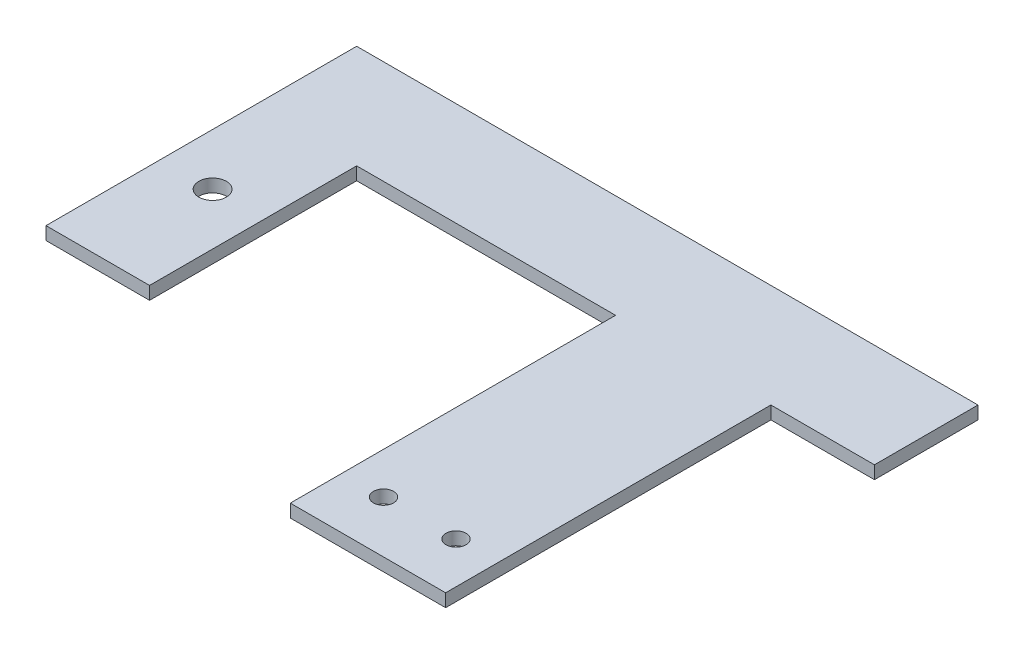
ISO-10303-21;
HEADER;
FILE_DESCRIPTION(('STEP AP214'),'2;1');
FILE_NAME('part.step','',(''),(''),'','','');
FILE_SCHEMA(('AUTOMOTIVE_DESIGN { 1 0 10303 214 1 1 1 1 }'));
ENDSEC;
DATA;
#1=APPLICATION_CONTEXT('core data for automotive mechanical design processes');
#2=APPLICATION_PROTOCOL_DEFINITION('international standard','automotive_design',2000,#1);
#3=PRODUCT_CONTEXT('',#1,'mechanical');
#4=PRODUCT('Part','Part','',(#3));
#5=PRODUCT_RELATED_PRODUCT_CATEGORY('part','',(#4));
#6=PRODUCT_DEFINITION_FORMATION('','',#4);
#7=PRODUCT_DEFINITION_CONTEXT('part definition',#1,'design');
#8=PRODUCT_DEFINITION('design','',#6,#7);
#9=PRODUCT_DEFINITION_SHAPE('','',#8);
#10=(LENGTH_UNIT() NAMED_UNIT(*) SI_UNIT(.MILLI.,.METRE.));
#11=(NAMED_UNIT(*) PLANE_ANGLE_UNIT() SI_UNIT($,.RADIAN.));
#12=(NAMED_UNIT(*) SI_UNIT($,.STERADIAN.) SOLID_ANGLE_UNIT());
#13=UNCERTAINTY_MEASURE_WITH_UNIT(LENGTH_MEASURE(1.E-05),#10,'distance_accuracy_value','');
#14=(GEOMETRIC_REPRESENTATION_CONTEXT(3) GLOBAL_UNCERTAINTY_ASSIGNED_CONTEXT((#13)) GLOBAL_UNIT_ASSIGNED_CONTEXT((#10,
#11,#12)) REPRESENTATION_CONTEXT('',''));
#15=CARTESIAN_POINT('',(0.,0.,0.));
#16=DIRECTION('',(0.,0.,1.));
#17=DIRECTION('',(1.,0.,0.));
#18=AXIS2_PLACEMENT_3D('',#15,#16,#17);
#19=CARTESIAN_POINT('',(127.,1.5875,0.));
#20=DIRECTION('',(1.,0.,0.));
#21=DIRECTION('',(0.,0.,-1.));
#22=AXIS2_PLACEMENT_3D('',#19,#20,#21);
#23=PLANE('',#22);
#24=DIRECTION('',(0.,0.,1.));
#25=VECTOR('',#24,1.);
#26=CARTESIAN_POINT('',(127.,-1.5875,0.));
#27=LINE('',#26,#25);
#28=CARTESIAN_POINT('',(127.,-1.5875,79.7814));
#29=VERTEX_POINT('',#28);
#30=CARTESIAN_POINT('',(127.,-1.5875,0.));
#31=VERTEX_POINT('',#30);
#32=EDGE_CURVE('E233',#29,#31,#27,.F.);
#33=ORIENTED_EDGE('',*,*,#32,.T.);
#34=DIRECTION('',(0.,1.,0.));
#35=VECTOR('',#34,1.);
#36=CARTESIAN_POINT('',(127.,0.,0.));
#37=LINE('',#36,#35);
#38=CARTESIAN_POINT('',(127.,1.5875,0.));
#39=VERTEX_POINT('',#38);
#40=EDGE_CURVE('E209',#31,#39,#37,.T.);
#41=ORIENTED_EDGE('',*,*,#40,.T.);
#42=DIRECTION('',(0.,0.,-1.));
#43=VECTOR('',#42,1.);
#44=CARTESIAN_POINT('',(127.,1.5875,0.));
#45=LINE('',#44,#43);
#46=CARTESIAN_POINT('',(127.,1.5875,79.7814));
#47=VERTEX_POINT('',#46);
#48=EDGE_CURVE('E230',#47,#39,#45,.T.);
#49=ORIENTED_EDGE('',*,*,#48,.F.);
#50=DIRECTION('',(0.,1.,0.));
#51=VECTOR('',#50,1.);
#52=CARTESIAN_POINT('',(127.,1.5875,79.7814));
#53=LINE('',#52,#51);
#54=EDGE_CURVE('E58',#29,#47,#53,.T.);
#55=ORIENTED_EDGE('',*,*,#54,.F.);
#56=EDGE_LOOP('',(#33,#41,#49,#55));
#57=FACE_BOUND('',#56,.T.);
#58=ADVANCED_FACE('F48',(#57),#23,.T.);
#59=CARTESIAN_POINT('',(88.9,1.5875,0.));
#60=DIRECTION('',(-1.,0.,0.));
#61=DIRECTION('',(0.,0.,1.));
#62=AXIS2_PLACEMENT_3D('',#59,#60,#61);
#63=PLANE('',#62);
#64=DIRECTION('',(0.,0.,1.));
#65=VECTOR('',#64,1.);
#66=CARTESIAN_POINT('',(88.9,1.5875,0.));
#67=LINE('',#66,#65);
#68=CARTESIAN_POINT('',(88.9,1.5875,0.));
#69=VERTEX_POINT('',#68);
#70=CARTESIAN_POINT('',(88.9,1.5875,79.7814));
#71=VERTEX_POINT('',#70);
#72=EDGE_CURVE('E52',#69,#71,#67,.T.);
#73=ORIENTED_EDGE('',*,*,#72,.F.);
#74=DIRECTION('',(0.,1.,0.));
#75=VECTOR('',#74,1.);
#76=CARTESIAN_POINT('',(88.9,0.,0.));
#77=LINE('',#76,#75);
#78=CARTESIAN_POINT('',(88.9,-1.5875,0.));
#79=VERTEX_POINT('',#78);
#80=EDGE_CURVE('E212',#79,#69,#77,.T.);
#81=ORIENTED_EDGE('',*,*,#80,.F.);
#82=DIRECTION('',(0.,0.,1.));
#83=VECTOR('',#82,1.);
#84=CARTESIAN_POINT('',(88.9,-1.5875,0.));
#85=LINE('',#84,#83);
#86=CARTESIAN_POINT('',(88.9,-1.5875,79.7814));
#87=VERTEX_POINT('',#86);
#88=EDGE_CURVE('E81',#79,#87,#85,.T.);
#89=ORIENTED_EDGE('',*,*,#88,.T.);
#90=DIRECTION('',(0.,1.,0.));
#91=VECTOR('',#90,1.);
#92=CARTESIAN_POINT('',(88.9,1.5875,79.7814));
#93=LINE('',#92,#91);
#94=EDGE_CURVE('E12',#87,#71,#93,.T.);
#95=ORIENTED_EDGE('',*,*,#94,.T.);
#96=EDGE_LOOP('',(#73,#81,#89,#95));
#97=FACE_BOUND('',#96,.T.);
#98=ADVANCED_FACE('F252',(#97),#63,.T.);
#99=CARTESIAN_POINT('',(0.,1.5875,0.));
#100=DIRECTION('',(0.,1.,0.));
#101=DIRECTION('',(0.,0.,1.));
#102=AXIS2_PLACEMENT_3D('',#99,#100,#101);
#103=PLANE('',#102);
#104=CARTESIAN_POINT('',(116.84,1.5875,67.0814));
#105=DIRECTION('',(0.,1.,0.));
#106=DIRECTION('',(0.,0.,1.));
#107=AXIS2_PLACEMENT_3D('',#104,#105,#106);
#108=CIRCLE('',#107,2.4638);
#109=CARTESIAN_POINT('',(116.84,1.5875,69.5452));
#110=VERTEX_POINT('',#109);
#111=EDGE_CURVE('E216',#110,#110,#108,.T.);
#112=ORIENTED_EDGE('',*,*,#111,.F.);
#113=EDGE_LOOP('',(#112));
#114=FACE_BOUND('',#113,.T.);
#115=CARTESIAN_POINT('',(99.06,1.5875,67.0814));
#116=DIRECTION('',(0.,1.,0.));
#117=DIRECTION('',(0.,0.,1.));
#118=AXIS2_PLACEMENT_3D('',#115,#116,#117);
#119=CIRCLE('',#118,2.4638);
#120=CARTESIAN_POINT('',(99.06,1.5875,69.5452));
#121=VERTEX_POINT('',#120);
#122=EDGE_CURVE('E220',#121,#121,#119,.T.);
#123=ORIENTED_EDGE('',*,*,#122,.F.);
#124=EDGE_LOOP('',(#123));
#125=FACE_BOUND('',#124,.T.);
#126=ORIENTED_EDGE('',*,*,#48,.T.);
#127=DIRECTION('',(1.,0.,0.));
#128=VECTOR('',#127,1.);
#129=CARTESIAN_POINT('',(12.7,1.5875,0.));
#130=LINE('',#129,#128);
#131=CARTESIAN_POINT('',(152.4,1.5875,0.));
#132=VERTEX_POINT('',#131);
#133=EDGE_CURVE('E194',#39,#132,#130,.T.);
#134=ORIENTED_EDGE('',*,*,#133,.T.);
#135=DIRECTION('',(0.,0.,1.));
#136=VECTOR('',#135,1.);
#137=CARTESIAN_POINT('',(152.4,1.5875,0.));
#138=LINE('',#137,#136);
#139=CARTESIAN_POINT('',(152.4,1.58749999999999,-25.4));
#140=VERTEX_POINT('',#139);
#141=EDGE_CURVE('E155',#132,#140,#138,.F.);
#142=ORIENTED_EDGE('',*,*,#141,.T.);
#143=DIRECTION('',(-1.,0.,0.));
#144=VECTOR('',#143,1.);
#145=CARTESIAN_POINT('',(127.,1.58749999999999,-25.4));
#146=LINE('',#145,#144);
#147=CARTESIAN_POINT('',(0.,1.58749999999999,-25.4));
#148=VERTEX_POINT('',#147);
#149=EDGE_CURVE('E170',#140,#148,#146,.T.);
#150=ORIENTED_EDGE('',*,*,#149,.T.);
#151=DIRECTION('',(0.,0.,1.));
#152=VECTOR('',#151,1.);
#153=CARTESIAN_POINT('',(0.,1.5875,0.));
#154=LINE('',#153,#152);
#155=CARTESIAN_POINT('',(0.,1.5875,50.8));
#156=VERTEX_POINT('',#155);
#157=EDGE_CURVE('E136',#148,#156,#154,.T.);
#158=ORIENTED_EDGE('',*,*,#157,.T.);
#159=DIRECTION('',(1.,0.,0.));
#160=VECTOR('',#159,1.);
#161=CARTESIAN_POINT('',(0.,1.5875,50.8));
#162=LINE('',#161,#160);
#163=CARTESIAN_POINT('',(25.4,1.5875,50.8));
#164=VERTEX_POINT('',#163);
#165=EDGE_CURVE('E184',#156,#164,#162,.T.);
#166=ORIENTED_EDGE('',*,*,#165,.T.);
#167=DIRECTION('',(0.,0.,1.));
#168=VECTOR('',#167,1.);
#169=CARTESIAN_POINT('',(25.4,1.5875,0.));
#170=LINE('',#169,#168);
#171=CARTESIAN_POINT('',(25.4,1.5875,0.));
#172=VERTEX_POINT('',#171);
#173=EDGE_CURVE('E142',#164,#172,#170,.F.);
#174=ORIENTED_EDGE('',*,*,#173,.T.);
#175=DIRECTION('',(1.,0.,0.));
#176=VECTOR('',#175,1.);
#177=CARTESIAN_POINT('',(12.7,1.5875,0.));
#178=LINE('',#177,#176);
#179=EDGE_CURVE('E196',#172,#69,#178,.T.);
#180=ORIENTED_EDGE('',*,*,#179,.T.);
#181=ORIENTED_EDGE('',*,*,#72,.T.);
#182=DIRECTION('',(1.,0.,0.));
#183=VECTOR('',#182,1.);
#184=CARTESIAN_POINT('',(88.9,1.5875,79.7814));
#185=LINE('',#184,#183);
#186=EDGE_CURVE('E228',#71,#47,#185,.T.);
#187=ORIENTED_EDGE('',*,*,#186,.T.);
#188=EDGE_LOOP('',(#126,#134,#142,#150,#158,#166,#174,#180,#181,#187));
#189=FACE_BOUND('',#188,.T.);
#190=CARTESIAN_POINT('',(12.7,1.5875,22.6340140142972));
#191=DIRECTION('',(0.,1.,0.));
#192=DIRECTION('',(0.,0.,1.));
#193=AXIS2_PLACEMENT_3D('',#190,#191,#192);
#194=CIRCLE('',#193,3.3734375);
#195=CARTESIAN_POINT('',(12.7,1.5875,26.0074515142972));
#196=VERTEX_POINT('',#195);
#197=EDGE_CURVE('E186',#196,#196,#194,.T.);
#198=ORIENTED_EDGE('',*,*,#197,.F.);
#199=EDGE_LOOP('',(#198));
#200=FACE_BOUND('',#199,.T.);
#201=ADVANCED_FACE('F50',(#114,#125,#189,#200),#103,.T.);
#202=CARTESIAN_POINT('',(88.9,1.5875,79.7814));
#203=DIRECTION('',(0.,0.,1.));
#204=DIRECTION('',(1.,0.,0.));
#205=AXIS2_PLACEMENT_3D('',#202,#203,#204);
#206=PLANE('',#205);
#207=ORIENTED_EDGE('',*,*,#94,.F.);
#208=DIRECTION('',(1.,0.,0.));
#209=VECTOR('',#208,1.);
#210=CARTESIAN_POINT('',(0.,-1.5875,79.7814));
#211=LINE('',#210,#209);
#212=EDGE_CURVE('E231',#87,#29,#211,.T.);
#213=ORIENTED_EDGE('',*,*,#212,.T.);
#214=ORIENTED_EDGE('',*,*,#54,.T.);
#215=ORIENTED_EDGE('',*,*,#186,.F.);
#216=EDGE_LOOP('',(#207,#213,#214,#215));
#217=FACE_BOUND('',#216,.T.);
#218=ADVANCED_FACE('F260',(#217),#206,.T.);
#219=CARTESIAN_POINT('',(0.,-1.5875,0.));
#220=DIRECTION('',(0.,1.,0.));
#221=DIRECTION('',(0.,0.,1.));
#222=AXIS2_PLACEMENT_3D('',#219,#220,#221);
#223=PLANE('',#222);
#224=CARTESIAN_POINT('',(116.84,-1.5875,67.0814));
#225=DIRECTION('',(0.,1.,0.));
#226=DIRECTION('',(0.,0.,1.));
#227=AXIS2_PLACEMENT_3D('',#224,#225,#226);
#228=CIRCLE('',#227,2.4638);
#229=CARTESIAN_POINT('',(116.84,-1.5875,69.5452));
#230=VERTEX_POINT('',#229);
#231=EDGE_CURVE('E217',#230,#230,#228,.T.);
#232=ORIENTED_EDGE('',*,*,#231,.T.);
#233=EDGE_LOOP('',(#232));
#234=FACE_BOUND('',#233,.T.);
#235=CARTESIAN_POINT('',(99.06,-1.5875,67.0814));
#236=DIRECTION('',(0.,1.,0.));
#237=DIRECTION('',(0.,0.,1.));
#238=AXIS2_PLACEMENT_3D('',#235,#236,#237);
#239=CIRCLE('',#238,2.4638);
#240=CARTESIAN_POINT('',(99.06,-1.5875,69.5452));
#241=VERTEX_POINT('',#240);
#242=EDGE_CURVE('E223',#241,#241,#239,.T.);
#243=ORIENTED_EDGE('',*,*,#242,.T.);
#244=EDGE_LOOP('',(#243));
#245=FACE_BOUND('',#244,.T.);
#246=ORIENTED_EDGE('',*,*,#88,.F.);
#247=DIRECTION('',(1.,0.,0.));
#248=VECTOR('',#247,1.);
#249=CARTESIAN_POINT('',(12.7,-1.5875,0.));
#250=LINE('',#249,#248);
#251=CARTESIAN_POINT('',(25.4,-1.5875,0.));
#252=VERTEX_POINT('',#251);
#253=EDGE_CURVE('E204',#252,#79,#250,.T.);
#254=ORIENTED_EDGE('',*,*,#253,.F.);
#255=DIRECTION('',(0.,0.,1.));
#256=VECTOR('',#255,1.);
#257=CARTESIAN_POINT('',(25.4,-1.5875,0.));
#258=LINE('',#257,#256);
#259=CARTESIAN_POINT('',(25.4,-1.5875,50.8));
#260=VERTEX_POINT('',#259);
#261=EDGE_CURVE('E123',#260,#252,#258,.F.);
#262=ORIENTED_EDGE('',*,*,#261,.F.);
#263=DIRECTION('',(1.,0.,0.));
#264=VECTOR('',#263,1.);
#265=CARTESIAN_POINT('',(0.,-1.5875,50.8));
#266=LINE('',#265,#264);
#267=CARTESIAN_POINT('',(0.,-1.5875,50.8));
#268=VERTEX_POINT('',#267);
#269=EDGE_CURVE('E176',#268,#260,#266,.T.);
#270=ORIENTED_EDGE('',*,*,#269,.F.);
#271=DIRECTION('',(0.,0.,1.));
#272=VECTOR('',#271,1.);
#273=CARTESIAN_POINT('',(0.,-1.5875,0.));
#274=LINE('',#273,#272);
#275=CARTESIAN_POINT('',(0.,-1.58750000000001,-25.4));
#276=VERTEX_POINT('',#275);
#277=EDGE_CURVE('E148',#276,#268,#274,.T.);
#278=ORIENTED_EDGE('',*,*,#277,.F.);
#279=DIRECTION('',(1.,0.,0.));
#280=VECTOR('',#279,1.);
#281=CARTESIAN_POINT('',(0.,-1.58750000000001,-25.4));
#282=LINE('',#281,#280);
#283=CARTESIAN_POINT('',(152.4,-1.58750000000001,-25.4));
#284=VERTEX_POINT('',#283);
#285=EDGE_CURVE('E171',#284,#276,#282,.F.);
#286=ORIENTED_EDGE('',*,*,#285,.F.);
#287=DIRECTION('',(0.,0.,1.));
#288=VECTOR('',#287,1.);
#289=CARTESIAN_POINT('',(152.4,-1.5875,0.));
#290=LINE('',#289,#288);
#291=CARTESIAN_POINT('',(152.4,-1.5875,0.));
#292=VERTEX_POINT('',#291);
#293=EDGE_CURVE('E200',#292,#284,#290,.F.);
#294=ORIENTED_EDGE('',*,*,#293,.F.);
#295=DIRECTION('',(1.,0.,0.));
#296=VECTOR('',#295,1.);
#297=CARTESIAN_POINT('',(12.7,-1.5875,0.));
#298=LINE('',#297,#296);
#299=EDGE_CURVE('E202',#31,#292,#298,.T.);
#300=ORIENTED_EDGE('',*,*,#299,.F.);
#301=ORIENTED_EDGE('',*,*,#32,.F.);
#302=ORIENTED_EDGE('',*,*,#212,.F.);
#303=EDGE_LOOP('',(#246,#254,#262,#270,#278,#286,#294,#300,#301,#302));
#304=FACE_BOUND('',#303,.T.);
#305=CARTESIAN_POINT('',(12.7,-1.5875,22.6340140142972));
#306=DIRECTION('',(0.,1.,0.));
#307=DIRECTION('',(0.,0.,1.));
#308=AXIS2_PLACEMENT_3D('',#305,#306,#307);
#309=CIRCLE('',#308,3.3734375);
#310=CARTESIAN_POINT('',(12.7,-1.5875,26.0074515142972));
#311=VERTEX_POINT('',#310);
#312=EDGE_CURVE('E180',#311,#311,#309,.T.);
#313=ORIENTED_EDGE('',*,*,#312,.T.);
#314=EDGE_LOOP('',(#313));
#315=FACE_BOUND('',#314,.T.);
#316=ADVANCED_FACE('F262',(#234,#245,#304,#315),#223,.F.);
#317=CARTESIAN_POINT('',(99.06,-1.5875,67.0814));
#318=DIRECTION('',(0.,1.,0.));
#319=DIRECTION('',(0.,0.,1.));
#320=AXIS2_PLACEMENT_3D('',#317,#318,#319);
#321=CYLINDRICAL_SURFACE('',#320,2.4638);
#322=ORIENTED_EDGE('',*,*,#242,.F.);
#323=EDGE_LOOP('',(#322));
#324=FACE_BOUND('',#323,.T.);
#325=ORIENTED_EDGE('',*,*,#122,.T.);
#326=EDGE_LOOP('',(#325));
#327=FACE_BOUND('',#326,.T.);
#328=ADVANCED_FACE('F264',(#324,#327),#321,.F.);
#329=CARTESIAN_POINT('',(116.84,-1.5875,67.0814));
#330=DIRECTION('',(0.,1.,0.));
#331=DIRECTION('',(0.,0.,1.));
#332=AXIS2_PLACEMENT_3D('',#329,#330,#331);
#333=CYLINDRICAL_SURFACE('',#332,2.4638);
#334=ORIENTED_EDGE('',*,*,#231,.F.);
#335=EDGE_LOOP('',(#334));
#336=FACE_BOUND('',#335,.T.);
#337=ORIENTED_EDGE('',*,*,#111,.T.);
#338=EDGE_LOOP('',(#337));
#339=FACE_BOUND('',#338,.T.);
#340=ADVANCED_FACE('F271',(#336,#339),#333,.F.);
#341=CARTESIAN_POINT('',(25.4,0.,0.));
#342=DIRECTION('',(-1.,0.,0.));
#343=DIRECTION('',(0.,0.,1.));
#344=AXIS2_PLACEMENT_3D('',#341,#342,#343);
#345=PLANE('',#344);
#346=ORIENTED_EDGE('',*,*,#173,.F.);
#347=DIRECTION('',(0.,1.,0.));
#348=VECTOR('',#347,1.);
#349=CARTESIAN_POINT('',(25.4,1.5875,50.8));
#350=LINE('',#349,#348);
#351=EDGE_CURVE('E189',#260,#164,#350,.T.);
#352=ORIENTED_EDGE('',*,*,#351,.F.);
#353=ORIENTED_EDGE('',*,*,#261,.T.);
#354=DIRECTION('',(0.,1.,0.));
#355=VECTOR('',#354,1.);
#356=CARTESIAN_POINT('',(25.4,0.,0.));
#357=LINE('',#356,#355);
#358=EDGE_CURVE('E115',#252,#172,#357,.T.);
#359=ORIENTED_EDGE('',*,*,#358,.T.);
#360=EDGE_LOOP('',(#346,#352,#353,#359));
#361=FACE_BOUND('',#360,.T.);
#362=ADVANCED_FACE('F249',(#361),#345,.F.);
#363=CARTESIAN_POINT('',(12.7,0.,0.));
#364=DIRECTION('',(0.,0.,1.));
#365=DIRECTION('',(1.,0.,0.));
#366=AXIS2_PLACEMENT_3D('',#363,#364,#365);
#367=PLANE('',#366);
#368=ORIENTED_EDGE('',*,*,#358,.F.);
#369=ORIENTED_EDGE('',*,*,#253,.T.);
#370=ORIENTED_EDGE('',*,*,#80,.T.);
#371=ORIENTED_EDGE('',*,*,#179,.F.);
#372=EDGE_LOOP('',(#368,#369,#370,#371));
#373=FACE_BOUND('',#372,.T.);
#374=ADVANCED_FACE('F241',(#373),#367,.T.);
#375=CARTESIAN_POINT('',(12.7,0.,0.));
#376=DIRECTION('',(0.,0.,1.));
#377=DIRECTION('',(1.,0.,0.));
#378=AXIS2_PLACEMENT_3D('',#375,#376,#377);
#379=PLANE('',#378);
#380=ORIENTED_EDGE('',*,*,#40,.F.);
#381=ORIENTED_EDGE('',*,*,#299,.T.);
#382=DIRECTION('',(0.,1.,0.));
#383=VECTOR('',#382,1.);
#384=CARTESIAN_POINT('',(152.4,0.,0.));
#385=LINE('',#384,#383);
#386=EDGE_CURVE('E90',#292,#132,#385,.T.);
#387=ORIENTED_EDGE('',*,*,#386,.T.);
#388=ORIENTED_EDGE('',*,*,#133,.F.);
#389=EDGE_LOOP('',(#380,#381,#387,#388));
#390=FACE_BOUND('',#389,.T.);
#391=ADVANCED_FACE('F238',(#390),#379,.T.);
#392=CARTESIAN_POINT('',(152.4,0.,0.));
#393=DIRECTION('',(-1.,0.,0.));
#394=DIRECTION('',(0.,0.,1.));
#395=AXIS2_PLACEMENT_3D('',#392,#393,#394);
#396=PLANE('',#395);
#397=ORIENTED_EDGE('',*,*,#386,.F.);
#398=ORIENTED_EDGE('',*,*,#293,.T.);
#399=DIRECTION('',(0.,1.,0.));
#400=VECTOR('',#399,1.);
#401=CARTESIAN_POINT('',(152.4,1.58749999999999,-25.4));
#402=LINE('',#401,#400);
#403=EDGE_CURVE('E174',#284,#140,#402,.T.);
#404=ORIENTED_EDGE('',*,*,#403,.T.);
#405=ORIENTED_EDGE('',*,*,#141,.F.);
#406=EDGE_LOOP('',(#397,#398,#404,#405));
#407=FACE_BOUND('',#406,.T.);
#408=ADVANCED_FACE('F240',(#407),#396,.F.);
#409=CARTESIAN_POINT('',(0.,0.,0.));
#410=DIRECTION('',(-1.,0.,0.));
#411=DIRECTION('',(0.,0.,1.));
#412=AXIS2_PLACEMENT_3D('',#409,#410,#411);
#413=PLANE('',#412);
#414=ORIENTED_EDGE('',*,*,#277,.T.);
#415=DIRECTION('',(0.,1.,0.));
#416=VECTOR('',#415,1.);
#417=CARTESIAN_POINT('',(0.,1.5875,50.8));
#418=LINE('',#417,#416);
#419=EDGE_CURVE('E163',#268,#156,#418,.T.);
#420=ORIENTED_EDGE('',*,*,#419,.T.);
#421=ORIENTED_EDGE('',*,*,#157,.F.);
#422=DIRECTION('',(0.,1.,0.));
#423=VECTOR('',#422,1.);
#424=CARTESIAN_POINT('',(0.,1.58749999999999,-25.4));
#425=LINE('',#424,#423);
#426=EDGE_CURVE('E160',#276,#148,#425,.T.);
#427=ORIENTED_EDGE('',*,*,#426,.F.);
#428=EDGE_LOOP('',(#414,#420,#421,#427));
#429=FACE_BOUND('',#428,.T.);
#430=ADVANCED_FACE('F159',(#429),#413,.T.);
#431=CARTESIAN_POINT('',(0.,1.5875,50.8));
#432=DIRECTION('',(0.,0.,1.));
#433=DIRECTION('',(1.,0.,0.));
#434=AXIS2_PLACEMENT_3D('',#431,#432,#433);
#435=PLANE('',#434);
#436=ORIENTED_EDGE('',*,*,#269,.T.);
#437=ORIENTED_EDGE('',*,*,#351,.T.);
#438=ORIENTED_EDGE('',*,*,#165,.F.);
#439=ORIENTED_EDGE('',*,*,#419,.F.);
#440=EDGE_LOOP('',(#436,#437,#438,#439));
#441=FACE_BOUND('',#440,.T.);
#442=ADVANCED_FACE('F284',(#441),#435,.T.);
#443=CARTESIAN_POINT('',(12.7,-1.5875,22.6340140142972));
#444=DIRECTION('',(0.,1.,0.));
#445=DIRECTION('',(0.,0.,1.));
#446=AXIS2_PLACEMENT_3D('',#443,#444,#445);
#447=CYLINDRICAL_SURFACE('',#446,3.3734375);
#448=ORIENTED_EDGE('',*,*,#312,.F.);
#449=EDGE_LOOP('',(#448));
#450=FACE_BOUND('',#449,.T.);
#451=ORIENTED_EDGE('',*,*,#197,.T.);
#452=EDGE_LOOP('',(#451));
#453=FACE_BOUND('',#452,.T.);
#454=ADVANCED_FACE('F281',(#450,#453),#447,.F.);
#455=CARTESIAN_POINT('',(127.,1.58749999999999,-25.4));
#456=DIRECTION('',(0.,0.,-1.));
#457=DIRECTION('',(-1.,0.,0.));
#458=AXIS2_PLACEMENT_3D('',#455,#456,#457);
#459=PLANE('',#458);
#460=ORIENTED_EDGE('',*,*,#403,.F.);
#461=ORIENTED_EDGE('',*,*,#285,.T.);
#462=ORIENTED_EDGE('',*,*,#426,.T.);
#463=ORIENTED_EDGE('',*,*,#149,.F.);
#464=EDGE_LOOP('',(#460,#461,#462,#463));
#465=FACE_BOUND('',#464,.T.);
#466=ADVANCED_FACE('F169',(#465),#459,.T.);
#467=CLOSED_SHELL('',(#58,#98,#201,#218,#316,#328,#340,#362,#374,#391,#408,#430,#442,#454,#466));
#468=MANIFOLD_SOLID_BREP('B2',#467);
#469=ADVANCED_BREP_SHAPE_REPRESENTATION('',(#18,#468),#14);
#470=SHAPE_DEFINITION_REPRESENTATION(#9,#469);
ENDSEC;
END-ISO-10303-21;
